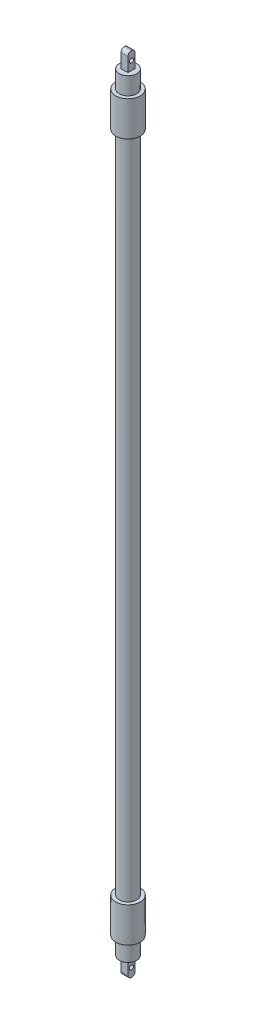
ISO-10303-21;
HEADER;
FILE_DESCRIPTION(('STEP AP214'),'2;1');
FILE_NAME('part.step','',(''),(''),'','','');
FILE_SCHEMA(('AUTOMOTIVE_DESIGN { 1 0 10303 214 1 1 1 1 }'));
ENDSEC;
DATA;
#1=APPLICATION_CONTEXT('core data for automotive mechanical design processes');
#2=APPLICATION_PROTOCOL_DEFINITION('international standard','automotive_design',2000,#1);
#3=PRODUCT_CONTEXT('',#1,'mechanical');
#4=PRODUCT('Part','Part','',(#3));
#5=PRODUCT_RELATED_PRODUCT_CATEGORY('part','',(#4));
#6=PRODUCT_DEFINITION_FORMATION('','',#4);
#7=PRODUCT_DEFINITION_CONTEXT('part definition',#1,'design');
#8=PRODUCT_DEFINITION('design','',#6,#7);
#9=PRODUCT_DEFINITION_SHAPE('','',#8);
#10=(LENGTH_UNIT() NAMED_UNIT(*) SI_UNIT(.MILLI.,.METRE.));
#11=(NAMED_UNIT(*) PLANE_ANGLE_UNIT() SI_UNIT($,.RADIAN.));
#12=(NAMED_UNIT(*) SI_UNIT($,.STERADIAN.) SOLID_ANGLE_UNIT());
#13=UNCERTAINTY_MEASURE_WITH_UNIT(LENGTH_MEASURE(1.E-05),#10,'distance_accuracy_value','');
#14=(GEOMETRIC_REPRESENTATION_CONTEXT(3) GLOBAL_UNCERTAINTY_ASSIGNED_CONTEXT((#13)) GLOBAL_UNIT_ASSIGNED_CONTEXT((#10,
#11,#12)) REPRESENTATION_CONTEXT('',''));
#15=CARTESIAN_POINT('',(0.,0.,0.));
#16=DIRECTION('',(0.,0.,1.));
#17=DIRECTION('',(1.,0.,0.));
#18=AXIS2_PLACEMENT_3D('',#15,#16,#17);
#19=CARTESIAN_POINT('',(-0.999999999999982,0.,1.));
#20=DIRECTION('',(1.,0.,0.));
#21=DIRECTION('',(0.,1.,0.));
#22=AXIS2_PLACEMENT_3D('',#19,#20,#21);
#23=PLANE('',#22);
#24=DIRECTION('',(0.,-1.,0.));
#25=VECTOR('',#24,1.);
#26=CARTESIAN_POINT('',(-0.999999999999982,0.,1.));
#27=LINE('',#26,#25);
#28=CARTESIAN_POINT('',(-1.,209.,1.));
#29=VERTEX_POINT('',#28);
#30=CARTESIAN_POINT('',(-1.,205.,1.));
#31=VERTEX_POINT('',#30);
#32=EDGE_CURVE('E146',#29,#31,#27,.T.);
#33=ORIENTED_EDGE('',*,*,#32,.F.);
#34=CARTESIAN_POINT('',(-1.,209.,0.));
#35=DIRECTION('',(1.,0.,0.));
#36=DIRECTION('',(0.,1.,0.));
#37=AXIS2_PLACEMENT_3D('',#34,#35,#36);
#38=CIRCLE('',#37,1.);
#39=CARTESIAN_POINT('',(-1.,210.,0.));
#40=VERTEX_POINT('',#39);
#41=EDGE_CURVE('E215',#29,#40,#38,.F.);
#42=ORIENTED_EDGE('',*,*,#41,.T.);
#43=CARTESIAN_POINT('',(-1.,209.,0.));
#44=DIRECTION('',(1.,0.,0.));
#45=DIRECTION('',(0.,1.,0.));
#46=AXIS2_PLACEMENT_3D('',#43,#44,#45);
#47=CIRCLE('',#46,1.);
#48=CARTESIAN_POINT('',(-1.,209.,-1.));
#49=VERTEX_POINT('',#48);
#50=EDGE_CURVE('E213',#40,#49,#47,.F.);
#51=ORIENTED_EDGE('',*,*,#50,.T.);
#52=DIRECTION('',(0.,-1.,0.));
#53=VECTOR('',#52,1.);
#54=CARTESIAN_POINT('',(-0.999999999999982,0.,-1.));
#55=LINE('',#54,#53);
#56=CARTESIAN_POINT('',(-1.,205.,-1.));
#57=VERTEX_POINT('',#56);
#58=EDGE_CURVE('E138',#49,#57,#55,.T.);
#59=ORIENTED_EDGE('',*,*,#58,.T.);
#60=DIRECTION('',(0.,0.,-1.));
#61=VECTOR('',#60,1.);
#62=CARTESIAN_POINT('',(-1.,205.,1.));
#63=LINE('',#62,#61);
#64=EDGE_CURVE('E162',#31,#57,#63,.T.);
#65=ORIENTED_EDGE('',*,*,#64,.F.);
#66=EDGE_LOOP('',(#33,#42,#51,#59,#65));
#67=FACE_BOUND('',#66,.T.);
#68=CARTESIAN_POINT('',(-0.999999999999999,207.5,0.));
#69=DIRECTION('',(1.,0.,0.));
#70=DIRECTION('',(0.,1.,0.));
#71=AXIS2_PLACEMENT_3D('',#68,#69,#70);
#72=CIRCLE('',#71,0.600000000000005);
#73=CARTESIAN_POINT('',(-0.999999999999999,208.1,0.));
#74=VERTEX_POINT('',#73);
#75=EDGE_CURVE('E200',#74,#74,#72,.F.);
#76=ORIENTED_EDGE('',*,*,#75,.F.);
#77=EDGE_LOOP('',(#76));
#78=FACE_BOUND('',#77,.T.);
#79=ADVANCED_FACE('F36',(#67,#78),#23,.F.);
#80=CARTESIAN_POINT('',(1.,0.,1.));
#81=DIRECTION('',(-1.,0.,0.));
#82=DIRECTION('',(0.,0.,1.));
#83=AXIS2_PLACEMENT_3D('',#80,#81,#82);
#84=PLANE('',#83);
#85=CARTESIAN_POINT('',(1.,209.,0.));
#86=DIRECTION('',(-1.,0.,0.));
#87=DIRECTION('',(0.,0.,1.));
#88=AXIS2_PLACEMENT_3D('',#85,#86,#87);
#89=CIRCLE('',#88,1.);
#90=CARTESIAN_POINT('',(1.,209.,-1.));
#91=VERTEX_POINT('',#90);
#92=CARTESIAN_POINT('',(1.,210.,0.));
#93=VERTEX_POINT('',#92);
#94=EDGE_CURVE('E217',#91,#93,#89,.F.);
#95=ORIENTED_EDGE('',*,*,#94,.T.);
#96=CARTESIAN_POINT('',(1.,209.,0.));
#97=DIRECTION('',(-1.,0.,0.));
#98=DIRECTION('',(0.,0.,1.));
#99=AXIS2_PLACEMENT_3D('',#96,#97,#98);
#100=CIRCLE('',#99,1.);
#101=CARTESIAN_POINT('',(1.,209.,1.));
#102=VERTEX_POINT('',#101);
#103=EDGE_CURVE('E219',#93,#102,#100,.F.);
#104=ORIENTED_EDGE('',*,*,#103,.T.);
#105=DIRECTION('',(0.,1.,0.));
#106=VECTOR('',#105,1.);
#107=CARTESIAN_POINT('',(1.,0.,1.));
#108=LINE('',#107,#106);
#109=CARTESIAN_POINT('',(1.,205.,1.));
#110=VERTEX_POINT('',#109);
#111=EDGE_CURVE('E152',#110,#102,#108,.T.);
#112=ORIENTED_EDGE('',*,*,#111,.F.);
#113=DIRECTION('',(0.,0.,-1.));
#114=VECTOR('',#113,1.);
#115=CARTESIAN_POINT('',(1.,205.,1.));
#116=LINE('',#115,#114);
#117=CARTESIAN_POINT('',(1.,205.,-1.));
#118=VERTEX_POINT('',#117);
#119=EDGE_CURVE('E154',#110,#118,#116,.T.);
#120=ORIENTED_EDGE('',*,*,#119,.T.);
#121=DIRECTION('',(0.,1.,0.));
#122=VECTOR('',#121,1.);
#123=CARTESIAN_POINT('',(1.,0.,-1.));
#124=LINE('',#123,#122);
#125=EDGE_CURVE('E149',#118,#91,#124,.T.);
#126=ORIENTED_EDGE('',*,*,#125,.T.);
#127=EDGE_LOOP('',(#95,#104,#112,#120,#126));
#128=FACE_BOUND('',#127,.T.);
#129=CARTESIAN_POINT('',(1.,207.5,0.));
#130=DIRECTION('',(-1.,0.,0.));
#131=DIRECTION('',(0.,0.,1.));
#132=AXIS2_PLACEMENT_3D('',#129,#130,#131);
#133=CIRCLE('',#132,0.600000000000005);
#134=CARTESIAN_POINT('',(1.,207.5,0.600000000000005));
#135=VERTEX_POINT('',#134);
#136=EDGE_CURVE('E201',#135,#135,#133,.F.);
#137=ORIENTED_EDGE('',*,*,#136,.F.);
#138=EDGE_LOOP('',(#137));
#139=FACE_BOUND('',#138,.T.);
#140=ADVANCED_FACE('F244',(#128,#139),#84,.F.);
#141=CARTESIAN_POINT('',(0.,-10.,0.));
#142=DIRECTION('',(0.,-1.,0.));
#143=DIRECTION('',(0.,0.,-1.));
#144=AXIS2_PLACEMENT_3D('',#141,#142,#143);
#145=PLANE('',#144);
#146=CARTESIAN_POINT('',(0.,-10.,0.));
#147=DIRECTION('',(0.,-1.,0.));
#148=DIRECTION('',(0.,0.,-1.));
#149=AXIS2_PLACEMENT_3D('',#146,#147,#148);
#150=CIRCLE('',#149,3.5);
#151=CARTESIAN_POINT('',(0.,-10.,-3.5));
#152=VERTEX_POINT('',#151);
#153=EDGE_CURVE('E172',#152,#152,#150,.T.);
#154=ORIENTED_EDGE('',*,*,#153,.T.);
#155=EDGE_LOOP('',(#154));
#156=FACE_BOUND('',#155,.T.);
#157=CARTESIAN_POINT('',(0.,-10.,0.));
#158=DIRECTION('',(0.,-1.,0.));
#159=DIRECTION('',(0.,0.,-1.));
#160=AXIS2_PLACEMENT_3D('',#157,#158,#159);
#161=CIRCLE('',#160,2.5);
#162=CARTESIAN_POINT('',(0.,-10.,-2.5));
#163=VERTEX_POINT('',#162);
#164=EDGE_CURVE('E165',#163,#163,#161,.T.);
#165=ORIENTED_EDGE('',*,*,#164,.F.);
#166=EDGE_LOOP('',(#165));
#167=FACE_BOUND('',#166,.T.);
#168=ADVANCED_FACE('F250',(#156,#167),#145,.T.);
#169=CARTESIAN_POINT('',(0.,200.,0.));
#170=DIRECTION('',(0.,1.,0.));
#171=DIRECTION('',(0.,0.,1.));
#172=AXIS2_PLACEMENT_3D('',#169,#170,#171);
#173=PLANE('',#172);
#174=CARTESIAN_POINT('',(0.,200.,0.));
#175=DIRECTION('',(0.,1.,0.));
#176=DIRECTION('',(0.,0.,1.));
#177=AXIS2_PLACEMENT_3D('',#174,#175,#176);
#178=CIRCLE('',#177,3.5);
#179=CARTESIAN_POINT('',(0.,200.,3.5));
#180=VERTEX_POINT('',#179);
#181=EDGE_CURVE('E187',#180,#180,#178,.T.);
#182=ORIENTED_EDGE('',*,*,#181,.T.);
#183=EDGE_LOOP('',(#182));
#184=FACE_BOUND('',#183,.T.);
#185=CARTESIAN_POINT('',(0.,200.,0.));
#186=DIRECTION('',(0.,1.,0.));
#187=DIRECTION('',(0.,0.,1.));
#188=AXIS2_PLACEMENT_3D('',#185,#186,#187);
#189=CIRCLE('',#188,2.5);
#190=CARTESIAN_POINT('',(0.,200.,2.5));
#191=VERTEX_POINT('',#190);
#192=EDGE_CURVE('E180',#191,#191,#189,.T.);
#193=ORIENTED_EDGE('',*,*,#192,.F.);
#194=EDGE_LOOP('',(#193));
#195=FACE_BOUND('',#194,.T.);
#196=ADVANCED_FACE('F266',(#184,#195),#173,.T.);
#197=CARTESIAN_POINT('',(0.,190.,0.));
#198=DIRECTION('',(0.,-1.,0.));
#199=DIRECTION('',(0.,0.,-1.));
#200=AXIS2_PLACEMENT_3D('',#197,#198,#199);
#201=CYLINDRICAL_SURFACE('',#200,2.5);
#202=CARTESIAN_POINT('',(0.,190.,0.));
#203=DIRECTION('',(0.,1.,0.));
#204=DIRECTION('',(0.,0.,1.));
#205=AXIS2_PLACEMENT_3D('',#202,#203,#204);
#206=CIRCLE('',#205,2.5);
#207=CARTESIAN_POINT('',(0.,190.,2.5));
#208=VERTEX_POINT('',#207);
#209=EDGE_CURVE('E190',#208,#208,#206,.T.);
#210=ORIENTED_EDGE('',*,*,#209,.F.);
#211=EDGE_LOOP('',(#210));
#212=FACE_BOUND('',#211,.T.);
#213=CARTESIAN_POINT('',(0.,0.,0.));
#214=DIRECTION('',(0.,-1.,0.));
#215=DIRECTION('',(0.,0.,-1.));
#216=AXIS2_PLACEMENT_3D('',#213,#214,#215);
#217=CIRCLE('',#216,2.5);
#218=CARTESIAN_POINT('',(0.,0.,-2.5));
#219=VERTEX_POINT('',#218);
#220=EDGE_CURVE('E175',#219,#219,#217,.T.);
#221=ORIENTED_EDGE('',*,*,#220,.F.);
#222=EDGE_LOOP('',(#221));
#223=FACE_BOUND('',#222,.T.);
#224=ADVANCED_FACE('F286',(#212,#223),#201,.T.);
#225=CARTESIAN_POINT('',(0.,190.,0.));
#226=DIRECTION('',(0.,1.,0.));
#227=DIRECTION('',(0.,0.,1.));
#228=AXIS2_PLACEMENT_3D('',#225,#226,#227);
#229=PLANE('',#228);
#230=CARTESIAN_POINT('',(0.,190.,0.));
#231=DIRECTION('',(0.,1.,0.));
#232=DIRECTION('',(0.,0.,1.));
#233=AXIS2_PLACEMENT_3D('',#230,#231,#232);
#234=CIRCLE('',#233,3.5);
#235=CARTESIAN_POINT('',(0.,190.,3.5));
#236=VERTEX_POINT('',#235);
#237=EDGE_CURVE('E184',#236,#236,#234,.T.);
#238=ORIENTED_EDGE('',*,*,#237,.F.);
#239=EDGE_LOOP('',(#238));
#240=FACE_BOUND('',#239,.T.);
#241=ORIENTED_EDGE('',*,*,#209,.T.);
#242=EDGE_LOOP('',(#241));
#243=FACE_BOUND('',#242,.T.);
#244=ADVANCED_FACE('F288',(#240,#243),#229,.F.);
#245=CARTESIAN_POINT('',(0.,200.,0.));
#246=DIRECTION('',(0.,-1.,0.));
#247=DIRECTION('',(0.,0.,-1.));
#248=AXIS2_PLACEMENT_3D('',#245,#246,#247);
#249=CYLINDRICAL_SURFACE('',#248,3.5);
#250=ORIENTED_EDGE('',*,*,#181,.F.);
#251=EDGE_LOOP('',(#250));
#252=FACE_BOUND('',#251,.T.);
#253=ORIENTED_EDGE('',*,*,#237,.T.);
#254=EDGE_LOOP('',(#253));
#255=FACE_BOUND('',#254,.T.);
#256=ADVANCED_FACE('F282',(#252,#255),#249,.T.);
#257=CARTESIAN_POINT('',(0.,205.,0.));
#258=DIRECTION('',(0.,-1.,0.));
#259=DIRECTION('',(0.,0.,-1.));
#260=AXIS2_PLACEMENT_3D('',#257,#258,#259);
#261=CYLINDRICAL_SURFACE('',#260,2.5);
#262=CARTESIAN_POINT('',(0.,205.,0.));
#263=DIRECTION('',(0.,1.,0.));
#264=DIRECTION('',(0.,0.,1.));
#265=AXIS2_PLACEMENT_3D('',#262,#263,#264);
#266=CIRCLE('',#265,2.5);
#267=CARTESIAN_POINT('',(0.,205.,2.5));
#268=VERTEX_POINT('',#267);
#269=EDGE_CURVE('E181',#268,#268,#266,.T.);
#270=ORIENTED_EDGE('',*,*,#269,.F.);
#271=EDGE_LOOP('',(#270));
#272=FACE_BOUND('',#271,.T.);
#273=ORIENTED_EDGE('',*,*,#192,.T.);
#274=EDGE_LOOP('',(#273));
#275=FACE_BOUND('',#274,.T.);
#276=ADVANCED_FACE('F278',(#272,#275),#261,.T.);
#277=CARTESIAN_POINT('',(0.,205.,0.));
#278=DIRECTION('',(0.,1.,0.));
#279=DIRECTION('',(0.,0.,1.));
#280=AXIS2_PLACEMENT_3D('',#277,#278,#279);
#281=PLANE('',#280);
#282=DIRECTION('',(-1.,0.,0.));
#283=VECTOR('',#282,1.);
#284=CARTESIAN_POINT('',(0.,205.,1.));
#285=LINE('',#284,#283);
#286=EDGE_CURVE('E148',#110,#31,#285,.T.);
#287=ORIENTED_EDGE('',*,*,#286,.T.);
#288=ORIENTED_EDGE('',*,*,#64,.T.);
#289=DIRECTION('',(-1.,0.,0.));
#290=VECTOR('',#289,1.);
#291=CARTESIAN_POINT('',(0.,205.,-1.));
#292=LINE('',#291,#290);
#293=EDGE_CURVE('E141',#118,#57,#292,.T.);
#294=ORIENTED_EDGE('',*,*,#293,.F.);
#295=ORIENTED_EDGE('',*,*,#119,.F.);
#296=EDGE_LOOP('',(#287,#288,#294,#295));
#297=FACE_BOUND('',#296,.T.);
#298=ORIENTED_EDGE('',*,*,#269,.T.);
#299=EDGE_LOOP('',(#298));
#300=FACE_BOUND('',#299,.T.);
#301=ADVANCED_FACE('F271',(#297,#300),#281,.T.);
#302=CARTESIAN_POINT('',(0.,0.,0.));
#303=DIRECTION('',(0.,-1.,0.));
#304=DIRECTION('',(0.,0.,-1.));
#305=AXIS2_PLACEMENT_3D('',#302,#303,#304);
#306=PLANE('',#305);
#307=CARTESIAN_POINT('',(0.,0.,0.));
#308=DIRECTION('',(0.,-1.,0.));
#309=DIRECTION('',(0.,0.,-1.));
#310=AXIS2_PLACEMENT_3D('',#307,#308,#309);
#311=CIRCLE('',#310,3.5);
#312=CARTESIAN_POINT('',(0.,0.,-3.5));
#313=VERTEX_POINT('',#312);
#314=EDGE_CURVE('E169',#313,#313,#311,.T.);
#315=ORIENTED_EDGE('',*,*,#314,.F.);
#316=EDGE_LOOP('',(#315));
#317=FACE_BOUND('',#316,.T.);
#318=ORIENTED_EDGE('',*,*,#220,.T.);
#319=EDGE_LOOP('',(#318));
#320=FACE_BOUND('',#319,.T.);
#321=ADVANCED_FACE('F268',(#317,#320),#306,.F.);
#322=CARTESIAN_POINT('',(0.,-10.,0.));
#323=DIRECTION('',(0.,1.,0.));
#324=DIRECTION('',(0.,0.,1.));
#325=AXIS2_PLACEMENT_3D('',#322,#323,#324);
#326=CYLINDRICAL_SURFACE('',#325,3.5);
#327=ORIENTED_EDGE('',*,*,#153,.F.);
#328=EDGE_LOOP('',(#327));
#329=FACE_BOUND('',#328,.T.);
#330=ORIENTED_EDGE('',*,*,#314,.T.);
#331=EDGE_LOOP('',(#330));
#332=FACE_BOUND('',#331,.T.);
#333=ADVANCED_FACE('F262',(#329,#332),#326,.T.);
#334=CARTESIAN_POINT('',(0.,-15.,0.));
#335=DIRECTION('',(0.,1.,0.));
#336=DIRECTION('',(0.,0.,1.));
#337=AXIS2_PLACEMENT_3D('',#334,#335,#336);
#338=CYLINDRICAL_SURFACE('',#337,2.5);
#339=CARTESIAN_POINT('',(0.,-15.,0.));
#340=DIRECTION('',(0.,-1.,0.));
#341=DIRECTION('',(0.,0.,-1.));
#342=AXIS2_PLACEMENT_3D('',#339,#340,#341);
#343=CIRCLE('',#342,2.5);
#344=CARTESIAN_POINT('',(0.,-15.,-2.5));
#345=VERTEX_POINT('',#344);
#346=EDGE_CURVE('E166',#345,#345,#343,.T.);
#347=ORIENTED_EDGE('',*,*,#346,.F.);
#348=EDGE_LOOP('',(#347));
#349=FACE_BOUND('',#348,.T.);
#350=ORIENTED_EDGE('',*,*,#164,.T.);
#351=EDGE_LOOP('',(#350));
#352=FACE_BOUND('',#351,.T.);
#353=ADVANCED_FACE('F259',(#349,#352),#338,.T.);
#354=CARTESIAN_POINT('',(0.,-15.,0.));
#355=DIRECTION('',(0.,-1.,0.));
#356=DIRECTION('',(0.,0.,-1.));
#357=AXIS2_PLACEMENT_3D('',#354,#355,#356);
#358=PLANE('',#357);
#359=DIRECTION('',(1.,0.,0.));
#360=VECTOR('',#359,1.);
#361=CARTESIAN_POINT('',(0.,-15.,1.));
#362=LINE('',#361,#360);
#363=CARTESIAN_POINT('',(-1.,-15.,1.));
#364=VERTEX_POINT('',#363);
#365=CARTESIAN_POINT('',(1.,-15.,1.));
#366=VERTEX_POINT('',#365);
#367=EDGE_CURVE('E125',#364,#366,#362,.T.);
#368=ORIENTED_EDGE('',*,*,#367,.T.);
#369=DIRECTION('',(0.,0.,-1.));
#370=VECTOR('',#369,1.);
#371=CARTESIAN_POINT('',(1.,-15.,1.));
#372=LINE('',#371,#370);
#373=CARTESIAN_POINT('',(1.,-15.,-1.));
#374=VERTEX_POINT('',#373);
#375=EDGE_CURVE('E139',#366,#374,#372,.T.);
#376=ORIENTED_EDGE('',*,*,#375,.T.);
#377=DIRECTION('',(1.,0.,0.));
#378=VECTOR('',#377,1.);
#379=CARTESIAN_POINT('',(0.,-15.,-1.));
#380=LINE('',#379,#378);
#381=CARTESIAN_POINT('',(-1.,-15.,-1.));
#382=VERTEX_POINT('',#381);
#383=EDGE_CURVE('E137',#382,#374,#380,.T.);
#384=ORIENTED_EDGE('',*,*,#383,.F.);
#385=DIRECTION('',(0.,0.,-1.));
#386=VECTOR('',#385,1.);
#387=CARTESIAN_POINT('',(-1.,-15.,1.));
#388=LINE('',#387,#386);
#389=EDGE_CURVE('E118',#364,#382,#388,.T.);
#390=ORIENTED_EDGE('',*,*,#389,.F.);
#391=EDGE_LOOP('',(#368,#376,#384,#390));
#392=FACE_BOUND('',#391,.T.);
#393=ORIENTED_EDGE('',*,*,#346,.T.);
#394=EDGE_LOOP('',(#393));
#395=FACE_BOUND('',#394,.T.);
#396=ADVANCED_FACE('F135',(#392,#395),#358,.T.);
#397=CARTESIAN_POINT('',(0.,0.,1.));
#398=DIRECTION('',(0.,0.,1.));
#399=DIRECTION('',(1.,0.,0.));
#400=AXIS2_PLACEMENT_3D('',#397,#398,#399);
#401=PLANE('',#400);
#402=ORIENTED_EDGE('',*,*,#111,.T.);
#403=DIRECTION('',(-1.,0.,0.));
#404=VECTOR('',#403,1.);
#405=CARTESIAN_POINT('',(-1.,209.,1.));
#406=LINE('',#405,#404);
#407=EDGE_CURVE('E210',#102,#29,#406,.T.);
#408=ORIENTED_EDGE('',*,*,#407,.T.);
#409=ORIENTED_EDGE('',*,*,#32,.T.);
#410=ORIENTED_EDGE('',*,*,#286,.F.);
#411=EDGE_LOOP('',(#402,#408,#409,#410));
#412=FACE_BOUND('',#411,.T.);
#413=ADVANCED_FACE('F258',(#412),#401,.T.);
#414=CARTESIAN_POINT('',(0.,0.,-1.));
#415=DIRECTION('',(0.,0.,1.));
#416=DIRECTION('',(1.,0.,0.));
#417=AXIS2_PLACEMENT_3D('',#414,#415,#416);
#418=PLANE('',#417);
#419=ORIENTED_EDGE('',*,*,#58,.F.);
#420=DIRECTION('',(-1.,0.,0.));
#421=VECTOR('',#420,1.);
#422=CARTESIAN_POINT('',(0.,209.,-1.));
#423=LINE('',#422,#421);
#424=EDGE_CURVE('E221',#49,#91,#423,.F.);
#425=ORIENTED_EDGE('',*,*,#424,.T.);
#426=ORIENTED_EDGE('',*,*,#125,.F.);
#427=ORIENTED_EDGE('',*,*,#293,.T.);
#428=EDGE_LOOP('',(#419,#425,#426,#427));
#429=FACE_BOUND('',#428,.T.);
#430=ADVANCED_FACE('F324',(#429),#418,.F.);
#431=CARTESIAN_POINT('',(-0.999999999999999,0.,1.));
#432=DIRECTION('',(-1.,0.,0.));
#433=DIRECTION('',(0.,-1.,0.));
#434=AXIS2_PLACEMENT_3D('',#431,#432,#433);
#435=PLANE('',#434);
#436=CARTESIAN_POINT('',(-1.,-17.5,0.));
#437=DIRECTION('',(-1.,0.,0.));
#438=DIRECTION('',(0.,-1.,0.));
#439=AXIS2_PLACEMENT_3D('',#436,#437,#438);
#440=CIRCLE('',#439,0.6);
#441=CARTESIAN_POINT('',(-1.,-18.1,0.));
#442=VERTEX_POINT('',#441);
#443=EDGE_CURVE('E199',#442,#442,#440,.T.);
#444=ORIENTED_EDGE('',*,*,#443,.F.);
#445=EDGE_LOOP('',(#444));
#446=FACE_BOUND('',#445,.T.);
#447=DIRECTION('',(0.,1.,0.));
#448=VECTOR('',#447,1.);
#449=CARTESIAN_POINT('',(-0.999999999999999,0.,-1.));
#450=LINE('',#449,#448);
#451=CARTESIAN_POINT('',(-1.,-19.,-1.));
#452=VERTEX_POINT('',#451);
#453=EDGE_CURVE('E225',#452,#382,#450,.T.);
#454=ORIENTED_EDGE('',*,*,#453,.F.);
#455=CARTESIAN_POINT('',(-1.,-19.,0.));
#456=DIRECTION('',(-1.,0.,0.));
#457=DIRECTION('',(0.,-1.,0.));
#458=AXIS2_PLACEMENT_3D('',#455,#456,#457);
#459=CIRCLE('',#458,1.);
#460=CARTESIAN_POINT('',(-1.,-20.,0.));
#461=VERTEX_POINT('',#460);
#462=EDGE_CURVE('E45',#452,#461,#459,.T.);
#463=ORIENTED_EDGE('',*,*,#462,.T.);
#464=CARTESIAN_POINT('',(-1.,-19.,0.));
#465=DIRECTION('',(-1.,0.,0.));
#466=DIRECTION('',(0.,-1.,0.));
#467=AXIS2_PLACEMENT_3D('',#464,#465,#466);
#468=CIRCLE('',#467,1.);
#469=CARTESIAN_POINT('',(-1.,-19.,1.));
#470=VERTEX_POINT('',#469);
#471=EDGE_CURVE('E121',#461,#470,#468,.T.);
#472=ORIENTED_EDGE('',*,*,#471,.T.);
#473=DIRECTION('',(0.,1.,0.));
#474=VECTOR('',#473,1.);
#475=CARTESIAN_POINT('',(-0.999999999999999,0.,1.));
#476=LINE('',#475,#474);
#477=EDGE_CURVE('E113',#470,#364,#476,.T.);
#478=ORIENTED_EDGE('',*,*,#477,.T.);
#479=ORIENTED_EDGE('',*,*,#389,.T.);
#480=EDGE_LOOP('',(#454,#463,#472,#478,#479));
#481=FACE_BOUND('',#480,.T.);
#482=ADVANCED_FACE('F116',(#446,#481),#435,.T.);
#483=CARTESIAN_POINT('',(1.,0.,1.));
#484=DIRECTION('',(1.,0.,0.));
#485=DIRECTION('',(0.,0.,-1.));
#486=AXIS2_PLACEMENT_3D('',#483,#484,#485);
#487=PLANE('',#486);
#488=CARTESIAN_POINT('',(1.,-17.5,0.));
#489=DIRECTION('',(1.,0.,0.));
#490=DIRECTION('',(0.,0.,-1.));
#491=AXIS2_PLACEMENT_3D('',#488,#489,#490);
#492=CIRCLE('',#491,0.6);
#493=CARTESIAN_POINT('',(1.,-17.5,-0.6));
#494=VERTEX_POINT('',#493);
#495=EDGE_CURVE('E196',#494,#494,#492,.T.);
#496=ORIENTED_EDGE('',*,*,#495,.F.);
#497=EDGE_LOOP('',(#496));
#498=FACE_BOUND('',#497,.T.);
#499=CARTESIAN_POINT('',(1.,-19.,0.));
#500=DIRECTION('',(1.,0.,0.));
#501=DIRECTION('',(0.,0.,-1.));
#502=AXIS2_PLACEMENT_3D('',#499,#500,#501);
#503=CIRCLE('',#502,1.);
#504=CARTESIAN_POINT('',(1.,-19.,1.));
#505=VERTEX_POINT('',#504);
#506=CARTESIAN_POINT('',(1.,-20.,0.));
#507=VERTEX_POINT('',#506);
#508=EDGE_CURVE('E208',#505,#507,#503,.T.);
#509=ORIENTED_EDGE('',*,*,#508,.T.);
#510=CARTESIAN_POINT('',(1.,-19.,0.));
#511=DIRECTION('',(1.,0.,0.));
#512=DIRECTION('',(0.,0.,-1.));
#513=AXIS2_PLACEMENT_3D('',#510,#511,#512);
#514=CIRCLE('',#513,1.);
#515=CARTESIAN_POINT('',(1.,-19.,-1.));
#516=VERTEX_POINT('',#515);
#517=EDGE_CURVE('E11',#507,#516,#514,.T.);
#518=ORIENTED_EDGE('',*,*,#517,.T.);
#519=DIRECTION('',(0.,-1.,0.));
#520=VECTOR('',#519,1.);
#521=CARTESIAN_POINT('',(1.,0.,-1.));
#522=LINE('',#521,#520);
#523=EDGE_CURVE('E133',#374,#516,#522,.T.);
#524=ORIENTED_EDGE('',*,*,#523,.F.);
#525=ORIENTED_EDGE('',*,*,#375,.F.);
#526=DIRECTION('',(0.,-1.,0.));
#527=VECTOR('',#526,1.);
#528=CARTESIAN_POINT('',(1.,0.,1.));
#529=LINE('',#528,#527);
#530=EDGE_CURVE('E124',#366,#505,#529,.T.);
#531=ORIENTED_EDGE('',*,*,#530,.T.);
#532=EDGE_LOOP('',(#509,#518,#524,#525,#531));
#533=FACE_BOUND('',#532,.T.);
#534=ADVANCED_FACE('F330',(#498,#533),#487,.T.);
#535=CARTESIAN_POINT('',(0.,0.,1.));
#536=DIRECTION('',(0.,0.,1.));
#537=DIRECTION('',(1.,0.,0.));
#538=AXIS2_PLACEMENT_3D('',#535,#536,#537);
#539=PLANE('',#538);
#540=ORIENTED_EDGE('',*,*,#477,.F.);
#541=DIRECTION('',(-1.,0.,0.));
#542=VECTOR('',#541,1.);
#543=CARTESIAN_POINT('',(0.,-19.,1.));
#544=LINE('',#543,#542);
#545=EDGE_CURVE('E206',#470,#505,#544,.F.);
#546=ORIENTED_EDGE('',*,*,#545,.T.);
#547=ORIENTED_EDGE('',*,*,#530,.F.);
#548=ORIENTED_EDGE('',*,*,#367,.F.);
#549=EDGE_LOOP('',(#540,#546,#547,#548));
#550=FACE_BOUND('',#549,.T.);
#551=ADVANCED_FACE('F129',(#550),#539,.T.);
#552=CARTESIAN_POINT('',(0.,0.,-1.));
#553=DIRECTION('',(0.,0.,1.));
#554=DIRECTION('',(1.,0.,0.));
#555=AXIS2_PLACEMENT_3D('',#552,#553,#554);
#556=PLANE('',#555);
#557=ORIENTED_EDGE('',*,*,#523,.T.);
#558=DIRECTION('',(-1.,0.,0.));
#559=VECTOR('',#558,1.);
#560=CARTESIAN_POINT('',(-1.,-19.,-1.));
#561=LINE('',#560,#559);
#562=EDGE_CURVE('E223',#516,#452,#561,.T.);
#563=ORIENTED_EDGE('',*,*,#562,.T.);
#564=ORIENTED_EDGE('',*,*,#453,.T.);
#565=ORIENTED_EDGE('',*,*,#383,.T.);
#566=EDGE_LOOP('',(#557,#563,#564,#565));
#567=FACE_BOUND('',#566,.T.);
#568=ADVANCED_FACE('F231',(#567),#556,.F.);
#569=CARTESIAN_POINT('',(-12.5,-17.5,0.));
#570=DIRECTION('',(1.,0.,0.));
#571=DIRECTION('',(0.,0.,-1.));
#572=AXIS2_PLACEMENT_3D('',#569,#570,#571);
#573=CYLINDRICAL_SURFACE('',#572,0.6);
#574=ORIENTED_EDGE('',*,*,#443,.T.);
#575=EDGE_LOOP('',(#574));
#576=FACE_BOUND('',#575,.T.);
#577=ORIENTED_EDGE('',*,*,#495,.T.);
#578=EDGE_LOOP('',(#577));
#579=FACE_BOUND('',#578,.T.);
#580=ADVANCED_FACE('F340',(#576,#579),#573,.F.);
#581=CARTESIAN_POINT('',(-12.5,207.5,0.));
#582=DIRECTION('',(1.,0.,0.));
#583=DIRECTION('',(0.,0.,-1.));
#584=AXIS2_PLACEMENT_3D('',#581,#582,#583);
#585=CYLINDRICAL_SURFACE('',#584,0.600000000000005);
#586=ORIENTED_EDGE('',*,*,#136,.T.);
#587=EDGE_LOOP('',(#586));
#588=FACE_BOUND('',#587,.T.);
#589=ORIENTED_EDGE('',*,*,#75,.T.);
#590=EDGE_LOOP('',(#589));
#591=FACE_BOUND('',#590,.T.);
#592=ADVANCED_FACE('F241',(#588,#591),#585,.F.);
#593=CARTESIAN_POINT('',(0.,-19.,0.));
#594=DIRECTION('',(-1.,0.,0.));
#595=DIRECTION('',(0.,0.,1.));
#596=AXIS2_PLACEMENT_3D('',#593,#594,#595);
#597=CYLINDRICAL_SURFACE('',#596,1.);
#598=ORIENTED_EDGE('',*,*,#508,.F.);
#599=ORIENTED_EDGE('',*,*,#545,.F.);
#600=ORIENTED_EDGE('',*,*,#471,.F.);
#601=DIRECTION('',(-1.,0.,0.));
#602=VECTOR('',#601,1.);
#603=CARTESIAN_POINT('',(0.,-20.,0.));
#604=LINE('',#603,#602);
#605=EDGE_CURVE('E195',#507,#461,#604,.T.);
#606=ORIENTED_EDGE('',*,*,#605,.F.);
#607=EDGE_LOOP('',(#598,#599,#600,#606));
#608=FACE_BOUND('',#607,.T.);
#609=ADVANCED_FACE('F229',(#608),#597,.T.);
#610=CARTESIAN_POINT('',(0.,209.,0.));
#611=DIRECTION('',(-1.,0.,0.));
#612=DIRECTION('',(0.,0.,1.));
#613=AXIS2_PLACEMENT_3D('',#610,#611,#612);
#614=CYLINDRICAL_SURFACE('',#613,1.);
#615=DIRECTION('',(-1.,0.,0.));
#616=VECTOR('',#615,1.);
#617=CARTESIAN_POINT('',(0.,210.,0.));
#618=LINE('',#617,#616);
#619=EDGE_CURVE('E40',#93,#40,#618,.T.);
#620=ORIENTED_EDGE('',*,*,#619,.F.);
#621=ORIENTED_EDGE('',*,*,#94,.F.);
#622=ORIENTED_EDGE('',*,*,#424,.F.);
#623=ORIENTED_EDGE('',*,*,#50,.F.);
#624=EDGE_LOOP('',(#620,#621,#622,#623));
#625=FACE_BOUND('',#624,.T.);
#626=ADVANCED_FACE('F300',(#625),#614,.T.);
#627=CARTESIAN_POINT('',(0.,209.,0.));
#628=DIRECTION('',(1.,0.,0.));
#629=DIRECTION('',(0.,0.,-1.));
#630=AXIS2_PLACEMENT_3D('',#627,#628,#629);
#631=CYLINDRICAL_SURFACE('',#630,1.);
#632=ORIENTED_EDGE('',*,*,#103,.F.);
#633=ORIENTED_EDGE('',*,*,#619,.T.);
#634=ORIENTED_EDGE('',*,*,#41,.F.);
#635=ORIENTED_EDGE('',*,*,#407,.F.);
#636=EDGE_LOOP('',(#632,#633,#634,#635));
#637=FACE_BOUND('',#636,.T.);
#638=ADVANCED_FACE('F301',(#637),#631,.T.);
#639=CARTESIAN_POINT('',(0.,-19.,0.));
#640=DIRECTION('',(1.,0.,0.));
#641=DIRECTION('',(0.,0.,-1.));
#642=AXIS2_PLACEMENT_3D('',#639,#640,#641);
#643=CYLINDRICAL_SURFACE('',#642,1.);
#644=ORIENTED_EDGE('',*,*,#517,.F.);
#645=ORIENTED_EDGE('',*,*,#605,.T.);
#646=ORIENTED_EDGE('',*,*,#462,.F.);
#647=ORIENTED_EDGE('',*,*,#562,.F.);
#648=EDGE_LOOP('',(#644,#645,#646,#647));
#649=FACE_BOUND('',#648,.T.);
#650=ADVANCED_FACE('F38',(#649),#643,.T.);
#651=CLOSED_SHELL('',(#79,#140,#168,#196,#224,#244,#256,#276,#301,#321,#333,#353,#396,#413,#430,
#482,#534,#551,#568,#580,#592,#609,#626,#638,#650));
#652=MANIFOLD_SOLID_BREP('B2',#651);
#653=ADVANCED_BREP_SHAPE_REPRESENTATION('',(#18,#652),#14);
#654=SHAPE_DEFINITION_REPRESENTATION(#9,#653);
ENDSEC;
END-ISO-10303-21;
